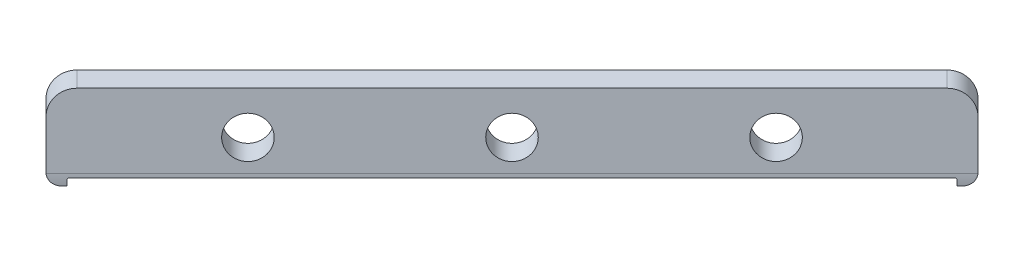
ISO-10303-21;
HEADER;
FILE_DESCRIPTION(('STEP AP214'),'2;1');
FILE_NAME('part.step','',(''),(''),'','','');
FILE_SCHEMA(('AUTOMOTIVE_DESIGN { 1 0 10303 214 1 1 1 1 }'));
ENDSEC;
DATA;
#1=APPLICATION_CONTEXT('core data for automotive mechanical design processes');
#2=APPLICATION_PROTOCOL_DEFINITION('international standard','automotive_design',2000,#1);
#3=PRODUCT_CONTEXT('',#1,'mechanical');
#4=PRODUCT('Part','Part','',(#3));
#5=PRODUCT_RELATED_PRODUCT_CATEGORY('part','',(#4));
#6=PRODUCT_DEFINITION_FORMATION('','',#4);
#7=PRODUCT_DEFINITION_CONTEXT('part definition',#1,'design');
#8=PRODUCT_DEFINITION('design','',#6,#7);
#9=PRODUCT_DEFINITION_SHAPE('','',#8);
#10=(LENGTH_UNIT() NAMED_UNIT(*) SI_UNIT(.MILLI.,.METRE.));
#11=(NAMED_UNIT(*) PLANE_ANGLE_UNIT() SI_UNIT($,.RADIAN.));
#12=(NAMED_UNIT(*) SI_UNIT($,.STERADIAN.) SOLID_ANGLE_UNIT());
#13=UNCERTAINTY_MEASURE_WITH_UNIT(LENGTH_MEASURE(1.E-05),#10,'distance_accuracy_value','');
#14=(GEOMETRIC_REPRESENTATION_CONTEXT(3) GLOBAL_UNCERTAINTY_ASSIGNED_CONTEXT((#13)) GLOBAL_UNIT_ASSIGNED_CONTEXT((#10,
#11,#12)) REPRESENTATION_CONTEXT('',''));
#15=CARTESIAN_POINT('',(0.,0.,0.));
#16=DIRECTION('',(0.,0.,1.));
#17=DIRECTION('',(1.,0.,0.));
#18=AXIS2_PLACEMENT_3D('',#15,#16,#17);
#19=CARTESIAN_POINT('',(-31.2479851302293,62.4688922805225,22.6335515961857));
#20=DIRECTION('',(-0.707106781186548,0.,0.707106781186547));
#21=DIRECTION('',(0.707106781186547,0.,0.707106781186548));
#22=AXIS2_PLACEMENT_3D('',#19,#20,#21);
#23=CYLINDRICAL_SURFACE('',#22,8.88999999999997);
#24=CARTESIAN_POINT('',(28.0159868484195,62.848,-24.0694986537815));
#25=CARTESIAN_POINT('',(28.0412127432073,62.8480002282446,-24.094726311048));
#26=CARTESIAN_POINT('',(28.0663830266467,62.8495042320577,-24.119985435108));
#27=CARTESIAN_POINT('',(28.1164494224557,62.8555042468426,-24.1704176401292));
#28=CARTESIAN_POINT('',(28.141345546684,62.8600001278811,-24.1955907247791));
#29=CARTESIAN_POINT('',(28.2153050213039,62.8779339085081,-24.2706830542423));
#30=CARTESIAN_POINT('',(28.2637187168926,62.8958180566461,-24.3202545375815));
#31=CARTESIAN_POINT('',(28.3571919829413,62.9429431235003,-24.4171103185936));
#32=CARTESIAN_POINT('',(28.4022498152059,62.9721898794838,-24.4643934266052));
#33=CARTESIAN_POINT('',(28.4874929717257,63.0411918179341,-24.5555514917085));
#34=CARTESIAN_POINT('',(28.5276794464005,63.0809445122393,-24.5994272525958));
#35=CARTESIAN_POINT('',(28.601704805909,63.1697413612886,-24.6827521998747));
#36=CARTESIAN_POINT('',(28.6355519643493,63.2187732350158,-24.7222071285899));
#37=CARTESIAN_POINT('',(28.6957126012145,63.3247343319157,-24.7959575845149));
#38=CARTESIAN_POINT('',(28.7220241511032,63.3816655711945,-24.8302517899126));
#39=CARTESIAN_POINT('',(28.7660461362825,63.501597398496,-24.8929457981475));
#40=CARTESIAN_POINT('',(28.7837723097044,63.5645866253135,-24.9213563313662));
#41=CARTESIAN_POINT('',(28.8099945653006,63.6948434084975,-24.9718427067502));
#42=CARTESIAN_POINT('',(28.8184989911839,63.7621070390009,-24.9939242619539));
#43=CARTESIAN_POINT('',(28.8240547282998,63.8634613155389,-25.0216931463825));
#44=CARTESIAN_POINT('',(28.8247554791441,63.8967054815829,-25.0299509305406));
#45=CARTESIAN_POINT('',(28.8239502498098,63.9634555626428,-25.0448754181973));
#46=CARTESIAN_POINT('',(28.822448520219,63.9969608496769,-25.0515451576238));
#47=CARTESIAN_POINT('',(28.8198509606969,64.0305353167753,-25.0574213196607));
#48=B_SPLINE_CURVE_WITH_KNOTS('',3,(#24,#25,#26,#27,#28,#29,#30,#31,#32,#33,#34,#35,#36,#37,#38,
#39,#40,#41,#42,#43,#44,#45,#46,#47),.UNSPECIFIED.,.F.,.F.,(4,2,2,2,2,2,2,2,2,2,2,4),(0.,
0.106962475027656,0.213920305124181,0.427504207309742,0.641197978500124,0.854841185061864,
1.06820358711933,1.28162054484922,1.49464478624726,1.70747612503121,1.81016795374532,
1.91266185714429),.UNSPECIFIED.);
#49=CARTESIAN_POINT('',(28.0159868484195,62.848,-24.0694986537815));
#50=VERTEX_POINT('',#49);
#51=CARTESIAN_POINT('',(28.8198509606969,64.0305353167753,-25.0574213196607));
#52=VERTEX_POINT('',#51);
#53=EDGE_CURVE('E299',#50,#52,#48,.T.);
#54=ORIENTED_EDGE('',*,*,#53,.T.);
#55=DIRECTION('',(-0.707106781186547,0.,0.707106781186547));
#56=VECTOR('',#55,1.);
#57=CARTESIAN_POINT('',(126.706774903379,64.0305353167753,-122.944345262343));
#58=LINE('',#57,#56);
#59=CARTESIAN_POINT('',(-25.0574213196608,64.0305353167753,28.819850960697));
#60=VERTEX_POINT('',#59);
#61=EDGE_CURVE('E434',#52,#60,#58,.T.);
#62=ORIENTED_EDGE('',*,*,#61,.T.);
#63=CARTESIAN_POINT('',(-25.0574213196608,64.0305353167753,28.819850960697));
#64=CARTESIAN_POINT('',(-25.0512550898484,63.995303137591,28.8225771900658));
#65=CARTESIAN_POINT('',(-25.0442146697091,63.9601465962603,28.8240959695621));
#66=CARTESIAN_POINT('',(-25.0284054763063,63.8902016106206,28.8247119564732));
#67=CARTESIAN_POINT('',(-25.0196366316676,63.8554131815751,28.823809063866));
#68=CARTESIAN_POINT('',(-24.9907939933517,63.7520215129004,28.8174633155482));
#69=CARTESIAN_POINT('',(-24.9681675664186,63.684296942904,28.8083906738733));
#70=CARTESIAN_POINT('',(-24.916496122564,63.5533070852542,28.7808866686694));
#71=CARTESIAN_POINT('',(-24.887445190294,63.4900459785954,28.7624466597295));
#72=CARTESIAN_POINT('',(-24.8234694406399,63.3699398805663,28.7169424505318));
#73=CARTESIAN_POINT('',(-24.788546905267,63.3130924108106,28.6898815971417));
#74=CARTESIAN_POINT('',(-24.7138285327782,63.2079609677876,28.6284529817684));
#75=CARTESIAN_POINT('',(-24.6740763185134,63.1596087617593,28.5941488241688));
#76=CARTESIAN_POINT('',(-24.5902683590469,63.0722836713819,28.5193544181621));
#77=CARTESIAN_POINT('',(-24.5462109496826,63.0333144343195,28.4788617741727));
#78=CARTESIAN_POINT('',(-24.4547848884541,62.9659116618471,28.3931371894814));
#79=CARTESIAN_POINT('',(-24.4074160958277,62.9374785746382,28.3479050472693));
#80=CARTESIAN_POINT('',(-24.3105054289195,62.8919874100948,28.2542258527261));
#81=CARTESIAN_POINT('',(-24.2609659826549,62.8749169524788,28.2057823628693));
#82=CARTESIAN_POINT('',(-24.1875085628317,62.8585081004216,28.1333554558058));
#83=CARTESIAN_POINT('',(-24.1639147231076,62.8545666439897,28.110003860227));
#84=CARTESIAN_POINT('',(-24.116704332366,62.8493152864763,28.0631133312156));
#85=CARTESIAN_POINT('',(-24.0930878963775,62.8480007174394,28.0395748048469));
#86=CARTESIAN_POINT('',(-24.0694986537816,62.848,28.0159868484195));
#87=B_SPLINE_CURVE_WITH_KNOTS('',3,(#63,#64,#65,#66,#67,#68,#69,#70,#71,#72,#73,#74,#75,#76,#77,
#78,#79,#80,#81,#82,#83,#84,#85,#86),.UNSPECIFIED.,.F.,.F.,(4,2,2,2,2,2,2,2,2,2,2,4),(0.,
0.107551107391848,0.215106657023032,0.429931453154058,0.644954878423281,0.859894926738172,
1.07302070294807,1.28622919076418,1.49944674729429,1.71243160828462,1.81263053817298,
1.91265125655463),.UNSPECIFIED.);
#88=CARTESIAN_POINT('',(-24.0694986537816,62.848,28.0159868484195));
#89=VERTEX_POINT('',#88);
#90=EDGE_CURVE('E266',#60,#89,#87,.T.);
#91=ORIENTED_EDGE('',*,*,#90,.T.);
#92=DIRECTION('',(-0.707106781186548,0.,0.707106781186547));
#93=VECTOR('',#92,1.);
#94=CARTESIAN_POINT('',(-24.9675242658885,62.848,28.9140124605265));
#95=LINE('',#94,#93);
#96=CARTESIAN_POINT('',(-23.7590219689426,62.848,27.7055101635805));
#97=VERTEX_POINT('',#96);
#98=EDGE_CURVE('E261',#97,#89,#95,.T.);
#99=ORIENTED_EDGE('',*,*,#98,.F.);
#100=CARTESIAN_POINT('',(-30.0394828332833,62.4688922805225,21.4250492992397));
#101=DIRECTION('',(-0.707106781186548,0.,0.707106781186547));
#102=DIRECTION('',(0.707106781186547,0.,0.707106781186548));
#103=AXIS2_PLACEMENT_3D('',#100,#101,#102);
#104=CIRCLE('',#103,8.88999999999997);
#105=CARTESIAN_POINT('',(-23.7893450362556,63.4195,27.6751870962675));
#106=VERTEX_POINT('',#105);
#107=EDGE_CURVE('E187',#106,#97,#104,.F.);
#108=ORIENTED_EDGE('',*,*,#107,.F.);
#109=CARTESIAN_POINT('',(-23.6706000891359,63.61,27.5245243597551));
#110=CARTESIAN_POINT('',(-23.6781364159323,63.6100093811594,27.5320581912541));
#111=CARTESIAN_POINT('',(-23.6855861216682,63.6091064455361,27.5396739374241));
#112=CARTESIAN_POINT('',(-23.7001047338185,63.6055459057236,27.5548431305062));
#113=CARTESIAN_POINT('',(-23.707174029225,63.6028901322639,27.5623966341019));
#114=CARTESIAN_POINT('',(-23.720743443548,63.5958922595912,27.5772347104279));
#115=CARTESIAN_POINT('',(-23.7272433407812,63.5915495071326,27.5845191777818));
#116=CARTESIAN_POINT('',(-23.7394947471439,63.5813086312477,27.5986057435977));
#117=CARTESIAN_POINT('',(-23.7452463311031,63.5754106635185,27.6054078902597));
#118=CARTESIAN_POINT('',(-23.7558711489443,63.5622021923687,27.6183617328608));
#119=CARTESIAN_POINT('',(-23.760740798807,63.5548861647993,27.6245107344846));
#120=CARTESIAN_POINT('',(-23.7694484743403,63.5390641309544,27.6359520537139));
#121=CARTESIAN_POINT('',(-23.7732862764535,63.5305578674113,27.6412441855734));
#122=CARTESIAN_POINT('',(-23.7798573716298,63.512527382874,27.6508560485324));
#123=CARTESIAN_POINT('',(-23.7825819316186,63.5029958273252,27.6551679776405));
#124=CARTESIAN_POINT('',(-23.7868144025665,63.4832392574551,27.662640982305));
#125=CARTESIAN_POINT('',(-23.7883229364736,63.4730146011108,27.6658026466651));
#126=CARTESIAN_POINT('',(-23.7898038628538,63.4555290697676,27.6700650784476));
#127=CARTESIAN_POINT('',(-23.7901146383983,63.4483749946559,27.6715016473021));
#128=CARTESIAN_POINT('',(-23.7901605482096,63.4339819164993,27.6737872572717));
#129=CARTESIAN_POINT('',(-23.7898964748386,63.4267430440187,27.6746371049865));
#130=CARTESIAN_POINT('',(-23.7893450362566,63.4195000000003,27.6751870962684));
#131=B_SPLINE_CURVE_WITH_KNOTS('',3,(#109,#110,#111,#112,#113,#114,#115,#116,#117,#118,#119,
#120,#121,#122,#123,#124,#125,#126,#127,#128,#129,#130),.UNSPECIFIED.,.F.,.F.,(4,2,2,2,2,2,2,2,
2,2,4),(0.,0.0319249195042498,0.0638165480767363,0.0957205383123213,0.127621335758462,
0.159648997530195,0.191683592752633,0.22396487669861,0.256229613003091,0.278096162980437,
0.299932591553004),.UNSPECIFIED.);
#132=CARTESIAN_POINT('',(-23.6706000891359,63.61,27.5245243597551));
#133=VERTEX_POINT('',#132);
#134=EDGE_CURVE('E185',#133,#106,#131,.T.);
#135=ORIENTED_EDGE('',*,*,#134,.F.);
#136=DIRECTION('',(-0.707106781186548,0.,0.707106781186547));
#137=VECTOR('',#136,1.);
#138=CARTESIAN_POINT('',(-25.0138062278978,63.61,28.8677304985171));
#139=LINE('',#138,#137);
#140=CARTESIAN_POINT('',(27.5245243597551,63.61,-23.6706000891358));
#141=VERTEX_POINT('',#140);
#142=EDGE_CURVE('E172',#133,#141,#139,.F.);
#143=ORIENTED_EDGE('',*,*,#142,.T.);
#144=CARTESIAN_POINT('',(27.6751870962675,63.4195,-23.7893450362555));
#145=CARTESIAN_POINT('',(27.6743742936584,63.4302771604047,-23.7901702881258));
#146=CARTESIAN_POINT('',(27.6728879495397,63.4410493246205,-23.7903515763147));
#147=CARTESIAN_POINT('',(27.6686428760586,63.4622782563258,-23.7894464589367));
#148=CARTESIAN_POINT('',(27.665884988579,63.4727352276302,-23.7883608914219));
#149=CARTESIAN_POINT('',(27.6591686222543,63.4930483527569,-23.7849425021465));
#150=CARTESIAN_POINT('',(27.6552095594449,63.5029042115366,-23.782609073303));
#151=CARTESIAN_POINT('',(27.6462100236924,63.5217275994173,-23.7767557464696));
#152=CARTESIAN_POINT('',(27.641169765034,63.5306953040297,-23.7732360835033));
#153=CARTESIAN_POINT('',(27.6301633725775,63.5474728462038,-23.7651068959936));
#154=CARTESIAN_POINT('',(27.6241987593929,63.5552845449214,-23.7604991549917));
#155=CARTESIAN_POINT('',(27.61151111056,63.5695416169412,-23.7503105710078));
#156=CARTESIAN_POINT('',(27.6047879414603,63.5759867492497,-23.7447295567053));
#157=CARTESIAN_POINT('',(27.5908258386263,63.5872834801227,-23.7327829971168));
#158=CARTESIAN_POINT('',(27.5835902636188,63.5921444640245,-23.7264223914855));
#159=CARTESIAN_POINT('',(27.5687811482089,63.6001791300746,-23.7130657989879));
#160=CARTESIAN_POINT('',(27.5612078477685,63.6033539901837,-23.7060702597106));
#161=CARTESIAN_POINT('',(27.5487426892403,63.6070882495557,-23.6942859726349));
#162=CARTESIAN_POINT('',(27.5438825918952,63.6081794806285,-23.6896252892082));
#163=CARTESIAN_POINT('',(27.5341793361975,63.6096352320611,-23.6801882959543));
#164=CARTESIAN_POINT('',(27.5293361636248,63.6100007745873,-23.6754121583681));
#165=CARTESIAN_POINT('',(27.5245243597553,63.6100000000006,-23.6706000891358));
#166=B_SPLINE_CURVE_WITH_KNOTS('',3,(#144,#145,#146,#147,#148,#149,#150,#151,#152,#153,#154,
#155,#156,#157,#158,#159,#160,#161,#162,#163,#164,#165),.UNSPECIFIED.,.F.,.F.,(4,2,2,2,2,2,2,2,
2,2,4),(0.,0.0324745968833057,0.0649277233003419,0.0973966525022864,0.129859152549427,
0.162268806055497,0.194684170249625,0.226903841408519,0.259100973531686,0.279528826582497,
0.299927885572257),.UNSPECIFIED.);
#167=CARTESIAN_POINT('',(27.6751870962675,63.4195,-23.7893450362555));
#168=VERTEX_POINT('',#167);
#169=EDGE_CURVE('E254',#168,#141,#166,.T.);
#170=ORIENTED_EDGE('',*,*,#169,.F.);
#171=CARTESIAN_POINT('',(21.4250492992397,62.4688922805225,-30.0394828332833));
#172=DIRECTION('',(0.707106781186547,0.,-0.707106781186548));
#173=DIRECTION('',(-0.707106781186548,0.,-0.707106781186547));
#174=AXIS2_PLACEMENT_3D('',#171,#172,#173);
#175=CIRCLE('',#174,8.88999999999997);
#176=CARTESIAN_POINT('',(27.7055101635805,62.848,-23.7590219689425));
#177=VERTEX_POINT('',#176);
#178=EDGE_CURVE('E263',#177,#168,#175,.F.);
#179=ORIENTED_EDGE('',*,*,#178,.F.);
#180=DIRECTION('',(-0.707106781186548,0.,0.707106781186547));
#181=VECTOR('',#180,1.);
#182=CARTESIAN_POINT('',(-24.9675242658885,62.848,28.9140124605265));
#183=LINE('',#182,#181);
#184=EDGE_CURVE('E275',#50,#177,#183,.T.);
#185=ORIENTED_EDGE('',*,*,#184,.F.);
#186=EDGE_LOOP('',(#54,#62,#91,#99,#108,#135,#143,#170,#179,#185));
#187=FACE_BOUND('',#186,.T.);
#188=ADVANCED_FACE('F49',(#187),#23,.T.);
#189=CARTESIAN_POINT('',(126.706774903379,64.0305353167753,-122.944345262343));
#190=DIRECTION('',(-0.696111539655782,-0.175662883717971,-0.696111539655782));
#191=DIRECTION('',(-0.707106781186548,0.,0.707106781186548));
#192=AXIS2_PLACEMENT_3D('',#189,#190,#191);
#193=PLANE('',#192);
#194=CARTESIAN_POINT('',(1.47840756711169,67.223000013,1.4784075671115));
#195=DIRECTION('',(-0.696111539655782,-0.175662883717971,-0.696111539655782));
#196=DIRECTION('',(-0.124212416279804,0.984450380305623,-0.124212416279719));
#197=AXIS2_PLACEMENT_3D('',#194,#195,#196);
#198=ELLIPSE('',#197,2.18395974343829,2.15);
#199=CARTESIAN_POINT('',(1.2071326503214,69.373000013,1.2071326503214));
#200=VERTEX_POINT('',#199);
#201=EDGE_CURVE('E330',#200,#200,#198,.F.);
#202=ORIENTED_EDGE('',*,*,#201,.F.);
#203=EDGE_LOOP('',(#202));
#204=FACE_BOUND('',#203,.T.);
#205=CARTESIAN_POINT('',(27.9129217694494,64.118,-24.1725637327517));
#206=DIRECTION('',(-0.696111539655782,-0.175662883717971,-0.696111539655782));
#207=DIRECTION('',(0.124212416279759,-0.984450380305623,0.124212416279764));
#208=AXIS2_PLACEMENT_3D('',#205,#206,#207);
#209=ELLIPSE('',#208,1.29005994147285,1.27);
#210=CARTESIAN_POINT('',(28.8109473815563,64.118,-25.0705893448586));
#211=VERTEX_POINT('',#210);
#212=EDGE_CURVE('E306',#52,#211,#209,.F.);
#213=ORIENTED_EDGE('',*,*,#212,.T.);
#214=DIRECTION('',(0.124212416279762,-0.984450380305623,0.124212416279762));
#215=VECTOR('',#214,1.);
#216=CARTESIAN_POINT('',(28.4457652343417,67.0122654403931,-25.4357714920732));
#217=LINE('',#216,#215);
#218=CARTESIAN_POINT('',(28.1876459415578,69.058000026,-25.693890784857));
#219=VERTEX_POINT('',#218);
#220=EDGE_CURVE('E321',#219,#211,#217,.T.);
#221=ORIENTED_EDGE('',*,*,#220,.F.);
#222=CARTESIAN_POINT('',(26.391594717344,69.058000026,-23.8978395606432));
#223=DIRECTION('',(-0.696111539655782,-0.175662883717971,-0.696111539655782));
#224=DIRECTION('',(-0.124212416279759,0.984450380305623,-0.124212416279764));
#225=AXIS2_PLACEMENT_3D('',#222,#223,#224);
#226=ELLIPSE('',#225,2.58011988294571,2.54);
#227=CARTESIAN_POINT('',(26.0711117923919,71.598000026,-24.2183224855954));
#228=VERTEX_POINT('',#227);
#229=EDGE_CURVE('E315',#219,#228,#226,.F.);
#230=ORIENTED_EDGE('',*,*,#229,.T.);
#231=DIRECTION('',(-0.707106781186548,0.,0.707106781186548));
#232=VECTOR('',#231,1.);
#233=CARTESIAN_POINT('',(0.926394653398243,71.598000026,0.926394653398243));
#234=LINE('',#233,#232);
#235=CARTESIAN_POINT('',(-24.2183224855954,71.598000026,26.0711117923919));
#236=VERTEX_POINT('',#235);
#237=EDGE_CURVE('E307',#228,#236,#234,.T.);
#238=ORIENTED_EDGE('',*,*,#237,.T.);
#239=CARTESIAN_POINT('',(-23.8978395606433,69.058000026,26.391594717344));
#240=DIRECTION('',(-0.696111539655782,-0.175662883717971,-0.696111539655782));
#241=DIRECTION('',(-0.124212416279761,0.984450380305623,-0.124212416279762));
#242=AXIS2_PLACEMENT_3D('',#239,#240,#241);
#243=ELLIPSE('',#242,2.58011988294571,2.54);
#244=CARTESIAN_POINT('',(-25.6938907848571,69.058000026,28.1876459415579));
#245=VERTEX_POINT('',#244);
#246=EDGE_CURVE('E426',#236,#245,#243,.F.);
#247=ORIENTED_EDGE('',*,*,#246,.T.);
#248=DIRECTION('',(-0.124212416279762,0.984450380305623,-0.124212416279762));
#249=VECTOR('',#248,1.);
#250=CARTESIAN_POINT('',(-25.4357714920732,67.0122654403931,28.4457652343418));
#251=LINE('',#250,#249);
#252=CARTESIAN_POINT('',(-25.0705893448586,64.118,28.8109473815563));
#253=VERTEX_POINT('',#252);
#254=EDGE_CURVE('E311',#253,#245,#251,.T.);
#255=ORIENTED_EDGE('',*,*,#254,.F.);
#256=CARTESIAN_POINT('',(-24.1725637327517,64.118,27.9129217694494));
#257=DIRECTION('',(-0.696111539655782,-0.175662883717971,-0.696111539655782));
#258=DIRECTION('',(0.124212416279761,-0.984450380305623,0.124212416279762));
#259=AXIS2_PLACEMENT_3D('',#256,#257,#258);
#260=ELLIPSE('',#259,1.29005994147285,1.27);
#261=EDGE_CURVE('E274',#253,#60,#260,.F.);
#262=ORIENTED_EDGE('',*,*,#261,.T.);
#263=ORIENTED_EDGE('',*,*,#61,.F.);
#264=EDGE_LOOP('',(#213,#221,#230,#238,#247,#255,#262,#263));
#265=FACE_BOUND('',#264,.T.);
#266=CARTESIAN_POINT('',(-13.7880278387059,67.223000013,16.7448429729291));
#267=DIRECTION('',(-0.696111539655782,-0.175662883717971,-0.696111539655782));
#268=DIRECTION('',(-0.124212416279804,0.984450380305623,-0.124212416279719));
#269=AXIS2_PLACEMENT_3D('',#266,#267,#268);
#270=ELLIPSE('',#269,2.18395974343829,2.15);
#271=CARTESIAN_POINT('',(-14.0593027554962,69.373000013,16.473568056139));
#272=VERTEX_POINT('',#271);
#273=EDGE_CURVE('E326',#272,#272,#270,.F.);
#274=ORIENTED_EDGE('',*,*,#273,.F.);
#275=EDGE_LOOP('',(#274));
#276=FACE_BOUND('',#275,.T.);
#277=CARTESIAN_POINT('',(16.7448429729293,67.223000013,-13.7880278387061));
#278=DIRECTION('',(-0.696111539655782,-0.175662883717971,-0.696111539655782));
#279=DIRECTION('',(-0.124212416279804,0.984450380305623,-0.124212416279719));
#280=AXIS2_PLACEMENT_3D('',#277,#278,#279);
#281=ELLIPSE('',#280,2.18395974343829,2.15);
#282=CARTESIAN_POINT('',(16.473568056139,69.373000013,-14.0593027554962));
#283=VERTEX_POINT('',#282);
#284=EDGE_CURVE('E53',#283,#283,#281,.F.);
#285=ORIENTED_EDGE('',*,*,#284,.F.);
#286=EDGE_LOOP('',(#285));
#287=FACE_BOUND('',#286,.T.);
#288=ADVANCED_FACE('F221',(#204,#265,#276,#287),#193,.F.);
#289=CARTESIAN_POINT('',(-31.2479851302293,62.4688922805225,22.6335515961857));
#290=DIRECTION('',(-0.707106781186548,0.,0.707106781186547));
#291=DIRECTION('',(0.707106781186547,0.,0.707106781186548));
#292=AXIS2_PLACEMENT_3D('',#289,#290,#291);
#293=CYLINDRICAL_SURFACE('',#292,6.34999999999997);
#294=CARTESIAN_POINT('',(-25.8678407481079,62.848,26.2176447540933));
#295=CARTESIAN_POINT('',(-25.8930326575949,62.8480002383866,26.2428341998516));
#296=CARTESIAN_POINT('',(-25.9182733473996,62.8494999436974,26.2679507582818));
#297=CARTESIAN_POINT('',(-25.9687066254805,62.8554827661656,26.317872931931));
#298=CARTESIAN_POINT('',(-25.9938992155361,62.8599657707176,26.3426785588501));
#299=CARTESIAN_POINT('',(-26.069110714877,62.8778479561075,26.4163073029911));
#300=CARTESIAN_POINT('',(-26.1188430631923,62.8956804206999,26.4644221064262));
#301=CARTESIAN_POINT('',(-26.2162335357284,62.9426628209707,26.5570878158099));
#302=CARTESIAN_POINT('',(-26.2638907200332,62.9718178269363,26.6016371143141));
#303=CARTESIAN_POINT('',(-26.3561034814072,63.0405993482787,26.6855881854187));
#304=CARTESIAN_POINT('',(-26.4006590287997,63.0802259638317,26.7249899087697));
#305=CARTESIAN_POINT('',(-26.4856871785837,63.1686608700612,26.7970357319768));
#306=CARTESIAN_POINT('',(-26.5261677891742,63.2174505897662,26.8296932241771));
#307=CARTESIAN_POINT('',(-26.6024109340328,63.3227643026712,26.8869888299151));
#308=CARTESIAN_POINT('',(-26.6381786035779,63.3792797386642,26.9116357155954));
#309=CARTESIAN_POINT('',(-26.6843418197286,63.4621653884538,26.9396857492428));
#310=CARTESIAN_POINT('',(-26.6969888064256,63.4860728106907,26.9469167074439));
#311=CARTESIAN_POINT('',(-26.7214151792851,63.5346529845675,26.9599199944478));
#312=CARTESIAN_POINT('',(-26.7331961749473,63.5593241887589,26.9656950802686));
#313=CARTESIAN_POINT('',(-26.7445498168314,63.5843515921316,26.9707328364162));
#314=B_SPLINE_CURVE_WITH_KNOTS('',3,(#294,#295,#296,#297,#298,#299,#300,#301,#302,#303,#304,
#305,#306,#307,#308,#309,#310,#311,#312,#313),.UNSPECIFIED.,.F.,.F.,(4,2,2,2,2,2,2,2,2,4),(0.,
0.106809446859322,0.213614862400691,0.426891571525335,0.640263897293669,0.853638264355755,
1.06658476069097,1.27929727466326,1.36323761045996,1.44701777184125),.UNSPECIFIED.);
#315=CARTESIAN_POINT('',(-25.8678407481079,62.848,26.2176447540933));
#316=VERTEX_POINT('',#315);
#317=CARTESIAN_POINT('',(-26.7445498168314,63.5843515921316,26.9707328364162));
#318=VERTEX_POINT('',#317);
#319=EDGE_CURVE('E229',#316,#318,#314,.T.);
#320=ORIENTED_EDGE('',*,*,#319,.T.);
#321=DIRECTION('',(0.707106781186548,0.,-0.707106781186547));
#322=VECTOR('',#321,1.);
#323=CARTESIAN_POINT('',(-124.712468573069,63.5843515921316,124.938651592654));
#324=LINE('',#323,#322);
#325=CARTESIAN_POINT('',(-25.5519770201795,63.5843515921316,25.7781600397643));
#326=VERTEX_POINT('',#325);
#327=EDGE_CURVE('E58',#318,#326,#324,.T.);
#328=ORIENTED_EDGE('',*,*,#327,.T.);
#329=CARTESIAN_POINT('',(-25.5999532994436,63.4195,25.8645788330794));
#330=CARTESIAN_POINT('',(-25.6011190271965,63.430340143401,25.8634249925374));
#331=CARTESIAN_POINT('',(-25.6016400026022,63.4411729730562,25.8615842736351));
#332=CARTESIAN_POINT('',(-25.6014013833345,63.4625111440655,25.8566165853199));
#333=CARTESIAN_POINT('',(-25.6006433910383,63.4730168784358,25.8534912290973));
#334=CARTESIAN_POINT('',(-25.597857527791,63.4934248141258,25.8460354721139));
#335=CARTESIAN_POINT('',(-25.5958286394455,63.5033265249289,25.8417041074481));
#336=CARTESIAN_POINT('',(-25.5905486874866,63.5222339964957,25.8319677865949));
#337=CARTESIAN_POINT('',(-25.5872977756976,63.531239868383,25.8265629638135));
#338=CARTESIAN_POINT('',(-25.5794248471284,63.5485822440341,25.8144943009539));
#339=CARTESIAN_POINT('',(-25.5747343321825,63.5568497835228,25.8077756768608));
#340=CARTESIAN_POINT('',(-25.5641922450713,63.57183969694,25.7935209658953));
#341=CARTESIAN_POINT('',(-25.5583374522888,63.5785576705682,25.7859826383818));
#342=CARTESIAN_POINT('',(-25.5519770201795,63.5843515921316,25.7781600397644));
#343=B_SPLINE_CURVE_WITH_KNOTS('',3,(#329,#330,#331,#332,#333,#334,#335,#336,#337,#338,#339,
#340,#341,#342),.UNSPECIFIED.,.F.,.F.,(4,2,2,2,2,2,4),(0.,0.0328470318916258,0.0656529413479993,
0.0984851466403467,0.13131327420135,0.166042466407805,0.20086909716315),.UNSPECIFIED.);
#344=CARTESIAN_POINT('',(-25.5999532994436,63.4195,25.8645788330794));
#345=VERTEX_POINT('',#344);
#346=EDGE_CURVE('E66',#345,#326,#343,.T.);
#347=ORIENTED_EDGE('',*,*,#346,.F.);
#348=CARTESIAN_POINT('',(-30.0394828332833,62.4688922805225,21.4250492992397));
#349=DIRECTION('',(-0.707106781186548,0.,0.707106781186547));
#350=DIRECTION('',(0.707106781186547,0.,0.707106781186548));
#351=AXIS2_PLACEMENT_3D('',#348,#349,#350);
#352=CIRCLE('',#351,6.34999999999997);
#353=CARTESIAN_POINT('',(-25.5573640632688,62.848,25.9071680692542));
#354=VERTEX_POINT('',#353);
#355=EDGE_CURVE('E265',#354,#345,#352,.T.);
#356=ORIENTED_EDGE('',*,*,#355,.F.);
#357=DIRECTION('',(-0.707106781186548,0.,0.707106781186547));
#358=VECTOR('',#357,1.);
#359=CARTESIAN_POINT('',(-26.7658663602148,62.848,27.1156703662002));
#360=LINE('',#359,#358);
#361=EDGE_CURVE('E349',#316,#354,#360,.F.);
#362=ORIENTED_EDGE('',*,*,#361,.F.);
#363=EDGE_LOOP('',(#320,#328,#347,#356,#362));
#364=FACE_BOUND('',#363,.T.);
#365=ADVANCED_FACE('F216',(#364),#293,.F.);
#366=CARTESIAN_POINT('',(26.9707328364162,63.5843515921316,-26.7445498168313));
#367=CARTESIAN_POINT('',(26.964342598223,63.5525946007026,-26.7301441379426));
#368=CARTESIAN_POINT('',(26.9567604303396,63.5214091139956,-26.7150473571422));
#369=CARTESIAN_POINT('',(26.939296863966,63.4603908771054,-26.6835124076873));
#370=CARTESIAN_POINT('',(26.9294155358265,63.4305580855653,-26.6670742800859));
#371=CARTESIAN_POINT('',(26.8964923343699,63.3435148984239,-26.6158750270826));
#372=CARTESIAN_POINT('',(26.8701453900028,63.2886329629063,-26.5791719576846));
#373=CARTESIAN_POINT('',(26.8097638465934,63.1869017077059,-26.5012379263312));
#374=CARTESIAN_POINT('',(26.7757252626825,63.1400565739228,-26.4600046230709));
#375=CARTESIAN_POINT('',(26.7013258883454,63.0558039632086,-26.3737427799782));
#376=CARTESIAN_POINT('',(26.6609643302515,63.0183976336774,-26.3287137796199));
#377=CARTESIAN_POINT('',(26.5754285092302,62.9541220766349,-26.2357459682868));
#378=CARTESIAN_POINT('',(26.5302509230346,62.9272601858785,-26.1878051579805));
#379=CARTESIAN_POINT('',(26.4366913456806,62.8849032392556,-26.0901102388639));
#380=CARTESIAN_POINT('',(26.3883127380828,62.8693963836807,-26.0403580689637));
#381=CARTESIAN_POINT('',(26.3190874535499,62.8558506452326,-25.9699531844519));
#382=CARTESIAN_POINT('',(26.2988934125562,62.8529052147302,-25.9495065085991));
#383=CARTESIAN_POINT('',(26.258364215815,62.8489824180477,-25.9086430367684));
#384=CARTESIAN_POINT('',(26.2380294089951,62.8480012523767,-25.8882262595882));
#385=CARTESIAN_POINT('',(26.2176447540932,62.848,-25.8678407481078));
#386=B_SPLINE_CURVE_WITH_KNOTS('',3,(#366,#367,#368,#369,#370,#371,#372,#373,#374,#375,#376,
#377,#378,#379,#380,#381,#382,#383,#384,#385),.UNSPECIFIED.,.F.,.F.,(4,2,2,2,2,2,2,2,2,4),(0.,
0.106292818240315,0.212582384519946,0.424742816203669,0.637013416560271,0.849309808538253,
1.06175365430121,1.27397642221977,1.36058772442902,1.44703133130506),.UNSPECIFIED.);
#387=CARTESIAN_POINT('',(26.9707328364162,63.5843515921316,-26.7445498168313));
#388=VERTEX_POINT('',#387);
#389=CARTESIAN_POINT('',(26.2176447540932,62.848,-25.8678407481078));
#390=VERTEX_POINT('',#389);
#391=EDGE_CURVE('E293',#388,#390,#386,.T.);
#392=ORIENTED_EDGE('',*,*,#391,.T.);
#393=DIRECTION('',(-0.707106781186548,0.,0.707106781186547));
#394=VECTOR('',#393,1.);
#395=CARTESIAN_POINT('',(-26.7658663602148,62.848,27.1156703662002));
#396=LINE('',#395,#394);
#397=CARTESIAN_POINT('',(25.9071680692542,62.848,-25.5573640632688));
#398=VERTEX_POINT('',#397);
#399=EDGE_CURVE('E313',#398,#390,#396,.F.);
#400=ORIENTED_EDGE('',*,*,#399,.F.);
#401=CARTESIAN_POINT('',(21.4250492992397,62.4688922805225,-30.0394828332833));
#402=DIRECTION('',(0.707106781186547,0.,-0.707106781186548));
#403=DIRECTION('',(-0.707106781186548,0.,-0.707106781186547));
#404=AXIS2_PLACEMENT_3D('',#401,#402,#403);
#405=CIRCLE('',#404,6.34999999999997);
#406=CARTESIAN_POINT('',(25.8645788330794,63.4195,-25.5999532994436));
#407=VERTEX_POINT('',#406);
#408=EDGE_CURVE('E243',#407,#398,#405,.T.);
#409=ORIENTED_EDGE('',*,*,#408,.F.);
#410=CARTESIAN_POINT('',(25.7781600397643,63.5843515921316,-25.5519770201795));
#411=CARTESIAN_POINT('',(25.7854398673875,63.5789570059463,-25.5578955297714));
#412=CARTESIAN_POINT('',(25.7924742921487,63.5727648353606,-25.5633775021717));
#413=CARTESIAN_POINT('',(25.8058473754217,63.5590161595347,-25.5733403711867));
#414=CARTESIAN_POINT('',(25.8121875933244,63.5514628173384,-25.5778235358933));
#415=CARTESIAN_POINT('',(25.8240047649106,63.5351927022338,-25.5856905565663));
#416=CARTESIAN_POINT('',(25.829481378283,63.526475473172,-25.5890739797246));
#417=CARTESIAN_POINT('',(25.8394159654709,63.5081265349639,-25.5946645431848));
#418=CARTESIAN_POINT('',(25.8438734395018,63.4984943804026,-25.5968711070605));
#419=CARTESIAN_POINT('',(25.8520306204528,63.4775733008712,-25.6002153073015));
#420=CARTESIAN_POINT('',(25.8556079711483,63.4662153612634,-25.6012221522455));
#421=CARTESIAN_POINT('',(25.861257458684,63.4430746158796,-25.6017277895128));
#422=CARTESIAN_POINT('',(25.8633265067773,63.4312909898412,-25.6012234980118));
#423=CARTESIAN_POINT('',(25.8645788330794,63.4195,-25.5999532994436));
#424=B_SPLINE_CURVE_WITH_KNOTS('',3,(#410,#411,#412,#413,#414,#415,#416,#417,#418,#419,#420,
#421,#422,#423),.UNSPECIFIED.,.F.,.F.,(4,2,2,2,2,2,4),(0.,0.0324193500284201,0.0647643143687621,
0.0971219928443035,0.129495505604076,0.165145593074683,0.200868482329345),.UNSPECIFIED.);
#425=CARTESIAN_POINT('',(25.7781600397643,63.5843515921316,-25.5519770201795));
#426=VERTEX_POINT('',#425);
#427=EDGE_CURVE('E73',#426,#407,#424,.T.);
#428=ORIENTED_EDGE('',*,*,#427,.F.);
#429=EDGE_CURVE('E12',#426,#388,#324,.T.);
#430=ORIENTED_EDGE('',*,*,#429,.T.);
#431=EDGE_LOOP('',(#392,#400,#409,#428,#430));
#432=FACE_BOUND('',#431,.T.);
#433=ADVANCED_FACE('F220',(#432),#293,.F.);
#434=CARTESIAN_POINT('',(-124.712468573069,63.5843515921316,124.938651592654));
#435=DIRECTION('',(0.696111539655782,0.175662883717971,0.696111539655782));
#436=DIRECTION('',(0.707106781186548,0.,-0.707106781186547));
#437=AXIS2_PLACEMENT_3D('',#434,#435,#436);
#438=PLANE('',#437);
#439=CARTESIAN_POINT('',(-0.346012698393469,67.223000013,-0.346012698393618));
#440=DIRECTION('',(0.696111539655782,0.175662883717971,0.696111539655782));
#441=DIRECTION('',(-0.124212416279805,0.984450380305623,-0.124212416279718));
#442=AXIS2_PLACEMENT_3D('',#439,#440,#441);
#443=ELLIPSE('',#442,2.18395974343829,2.15);
#444=CARTESIAN_POINT('',(-0.617287615183762,69.373000013,-0.617287615183722));
#445=VERTEX_POINT('',#444);
#446=EDGE_CURVE('E328',#445,#445,#443,.F.);
#447=ORIENTED_EDGE('',*,*,#446,.F.);
#448=EDGE_LOOP('',(#447));
#449=FACE_BOUND('',#448,.T.);
#450=CARTESIAN_POINT('',(26.0885015039443,64.118,-25.9969839982568));
#451=DIRECTION('',(0.696111539655782,0.175662883717971,0.696111539655782));
#452=DIRECTION('',(0.12421241627976,-0.984450380305623,0.124212416279764));
#453=AXIS2_PLACEMENT_3D('',#450,#451,#452);
#454=ELLIPSE('',#453,1.29005994147285,1.27);
#455=CARTESIAN_POINT('',(26.9865271160512,64.118,-26.8950096103637));
#456=VERTEX_POINT('',#455);
#457=EDGE_CURVE('E305',#456,#388,#454,.F.);
#458=ORIENTED_EDGE('',*,*,#457,.T.);
#459=ORIENTED_EDGE('',*,*,#429,.F.);
#460=CARTESIAN_POINT('',(25.731453781651,63.4195,-25.4636706672399));
#461=DIRECTION('',(0.696111539655782,0.175662883717971,0.696111539655782));
#462=DIRECTION('',(0.124212416279765,-0.984450380305623,0.124212416279759));
#463=AXIS2_PLACEMENT_3D('',#460,#461,#462);
#464=ELLIPSE('',#463,0.193508991220928,0.1905);
#465=CARTESIAN_POINT('',(25.7074175622796,63.61,-25.4877068866113));
#466=VERTEX_POINT('',#465);
#467=EDGE_CURVE('E242',#466,#426,#464,.F.);
#468=ORIENTED_EDGE('',*,*,#467,.F.);
#469=DIRECTION('',(-0.707106781186548,0.,0.707106781186547));
#470=VECTOR('',#469,1.);
#471=CARTESIAN_POINT('',(0.109855337834174,63.61,0.109855337834174));
#472=LINE('',#471,#470);
#473=CARTESIAN_POINT('',(-25.4877068866113,63.61,25.7074175622797));
#474=VERTEX_POINT('',#473);
#475=EDGE_CURVE('E181',#466,#474,#472,.T.);
#476=ORIENTED_EDGE('',*,*,#475,.T.);
#477=CARTESIAN_POINT('',(-25.4636706672399,63.4195,25.7314537816511));
#478=DIRECTION('',(0.696111539655782,0.175662883717971,0.696111539655782));
#479=DIRECTION('',(-0.124212416279757,0.984450380305623,-0.124212416279766));
#480=AXIS2_PLACEMENT_3D('',#477,#478,#479);
#481=ELLIPSE('',#480,0.193508991220928,0.1905);
#482=EDGE_CURVE('E189',#326,#474,#481,.F.);
#483=ORIENTED_EDGE('',*,*,#482,.F.);
#484=ORIENTED_EDGE('',*,*,#327,.F.);
#485=CARTESIAN_POINT('',(-25.9969839982568,64.118,26.0885015039443));
#486=DIRECTION('',(0.696111539655782,0.175662883717971,0.696111539655782));
#487=DIRECTION('',(0.124212416279762,-0.984450380305623,0.124212416279762));
#488=AXIS2_PLACEMENT_3D('',#485,#486,#487);
#489=ELLIPSE('',#488,1.29005994147285,1.27);
#490=CARTESIAN_POINT('',(-26.8950096103637,64.118,26.9865271160512));
#491=VERTEX_POINT('',#490);
#492=EDGE_CURVE('E273',#318,#491,#489,.F.);
#493=ORIENTED_EDGE('',*,*,#492,.T.);
#494=DIRECTION('',(0.124212416279762,-0.984450380305623,0.124212416279762));
#495=VECTOR('',#494,1.);
#496=CARTESIAN_POINT('',(-27.2038948027989,66.5660817157495,26.6776419236161));
#497=LINE('',#496,#495);
#498=CARTESIAN_POINT('',(-27.5183110503622,69.058000026,26.3632256760527));
#499=VERTEX_POINT('',#498);
#500=EDGE_CURVE('E314',#499,#491,#497,.T.);
#501=ORIENTED_EDGE('',*,*,#500,.F.);
#502=CARTESIAN_POINT('',(-25.7222598261484,69.058000026,24.5671744518389));
#503=DIRECTION('',(0.696111539655782,0.175662883717971,0.696111539655782));
#504=DIRECTION('',(-0.124212416279762,0.984450380305623,-0.124212416279762));
#505=AXIS2_PLACEMENT_3D('',#502,#503,#504);
#506=ELLIPSE('',#505,2.5801198829457,2.54);
#507=CARTESIAN_POINT('',(-26.0427427511006,71.598000026,24.2466915268867));
#508=VERTEX_POINT('',#507);
#509=EDGE_CURVE('E182',#499,#508,#506,.F.);
#510=ORIENTED_EDGE('',*,*,#509,.T.);
#511=DIRECTION('',(0.707106781186548,0.,-0.707106781186547));
#512=VECTOR('',#511,1.);
#513=CARTESIAN_POINT('',(-0.898025612106901,71.598000026,-0.898025612106901));
#514=LINE('',#513,#512);
#515=CARTESIAN_POINT('',(24.2466915268867,71.598000026,-26.0427427511005));
#516=VERTEX_POINT('',#515);
#517=EDGE_CURVE('E310',#508,#516,#514,.T.);
#518=ORIENTED_EDGE('',*,*,#517,.T.);
#519=CARTESIAN_POINT('',(24.5671744518389,69.058000026,-25.7222598261484));
#520=DIRECTION('',(0.696111539655782,0.175662883717971,0.696111539655782));
#521=DIRECTION('',(-0.12421241627976,0.984450380305623,-0.124212416279764));
#522=AXIS2_PLACEMENT_3D('',#519,#520,#521);
#523=ELLIPSE('',#522,2.5801198829457,2.54);
#524=CARTESIAN_POINT('',(26.3632256760527,69.058000026,-27.5183110503622));
#525=VERTEX_POINT('',#524);
#526=EDGE_CURVE('E318',#516,#525,#523,.F.);
#527=ORIENTED_EDGE('',*,*,#526,.T.);
#528=DIRECTION('',(-0.124212416279762,0.984450380305623,-0.124212416279762));
#529=VECTOR('',#528,1.);
#530=CARTESIAN_POINT('',(26.677641923616,66.5660817157495,-27.2038948027988));
#531=LINE('',#530,#529);
#532=EDGE_CURVE('E323',#456,#525,#531,.T.);
#533=ORIENTED_EDGE('',*,*,#532,.F.);
#534=EDGE_LOOP('',(#458,#459,#468,#476,#483,#484,#493,#501,#510,#518,#527,#533));
#535=FACE_BOUND('',#534,.T.);
#536=CARTESIAN_POINT('',(-15.612448104211,67.223000013,14.9204227074239));
#537=DIRECTION('',(0.696111539655782,0.175662883717971,0.696111539655782));
#538=DIRECTION('',(-0.124212416279805,0.984450380305623,-0.124212416279718));
#539=AXIS2_PLACEMENT_3D('',#536,#537,#538);
#540=ELLIPSE('',#539,2.18395974343829,2.15);
#541=CARTESIAN_POINT('',(-15.8837230210013,69.373000013,14.6491477906338));
#542=VERTEX_POINT('',#541);
#543=EDGE_CURVE('E329',#542,#542,#540,.F.);
#544=ORIENTED_EDGE('',*,*,#543,.F.);
#545=EDGE_LOOP('',(#544));
#546=FACE_BOUND('',#545,.T.);
#547=CARTESIAN_POINT('',(14.9204227074241,67.223000013,-15.6124481042112));
#548=DIRECTION('',(0.696111539655782,0.175662883717971,0.696111539655782));
#549=DIRECTION('',(-0.124212416279805,0.984450380305623,-0.124212416279718));
#550=AXIS2_PLACEMENT_3D('',#547,#548,#549);
#551=ELLIPSE('',#550,2.18395974343829,2.15);
#552=CARTESIAN_POINT('',(14.6491477906338,69.373000013,-15.8837230210013));
#553=VERTEX_POINT('',#552);
#554=EDGE_CURVE('E332',#553,#553,#551,.F.);
#555=ORIENTED_EDGE('',*,*,#554,.F.);
#556=EDGE_LOOP('',(#555));
#557=FACE_BOUND('',#556,.T.);
#558=ADVANCED_FACE('F51',(#449,#535,#546,#557),#438,.F.);
#559=CARTESIAN_POINT('',(-41.937796085393,62.848,11.943740641022));
#560=DIRECTION('',(0.707106781186548,0.,-0.707106781186547));
#561=DIRECTION('',(-0.707106781186547,0.,-0.707106781186548));
#562=AXIS2_PLACEMENT_3D('',#559,#560,#561);
#563=PLANE('',#562);
#564=DIRECTION('',(0.707106781186547,0.,0.707106781186548));
#565=VECTOR('',#564,1.);
#566=CARTESIAN_POINT('',(-41.937796085393,64.118,11.943740641022));
#567=LINE('',#566,#565);
#568=EDGE_CURVE('E416',#491,#253,#567,.T.);
#569=ORIENTED_EDGE('',*,*,#568,.T.);
#570=ORIENTED_EDGE('',*,*,#254,.T.);
#571=DIRECTION('',(0.707106781186547,0.,0.707106781186548));
#572=VECTOR('',#571,1.);
#573=CARTESIAN_POINT('',(-37.4476680248584,69.058000026,16.4338687015565));
#574=LINE('',#573,#572);
#575=EDGE_CURVE('E411',#245,#499,#574,.F.);
#576=ORIENTED_EDGE('',*,*,#575,.T.);
#577=ORIENTED_EDGE('',*,*,#500,.T.);
#578=EDGE_LOOP('',(#569,#570,#576,#577));
#579=FACE_BOUND('',#578,.T.);
#580=ADVANCED_FACE('F284',(#579),#563,.F.);
#581=CARTESIAN_POINT('',(0.,71.598000026,0.));
#582=DIRECTION('',(0.,1.,0.));
#583=DIRECTION('',(0.,0.,1.));
#584=AXIS2_PLACEMENT_3D('',#581,#582,#583);
#585=PLANE('',#584);
#586=ORIENTED_EDGE('',*,*,#237,.F.);
#587=DIRECTION('',(0.707106781186547,0.,0.707106781186548));
#588=VECTOR('',#587,1.);
#589=CARTESIAN_POINT('',(14.6378174773427,71.598000026,-35.6516168006445));
#590=LINE('',#589,#588);
#591=EDGE_CURVE('E194',#228,#516,#590,.F.);
#592=ORIENTED_EDGE('',*,*,#591,.T.);
#593=ORIENTED_EDGE('',*,*,#517,.F.);
#594=DIRECTION('',(0.707106781186547,0.,0.707106781186548));
#595=VECTOR('',#594,1.);
#596=CARTESIAN_POINT('',(-14.6378174773427,71.598000026,35.6516168006446));
#597=LINE('',#596,#595);
#598=EDGE_CURVE('E199',#508,#236,#597,.T.);
#599=ORIENTED_EDGE('',*,*,#598,.T.);
#600=EDGE_LOOP('',(#586,#592,#593,#599));
#601=FACE_BOUND('',#600,.T.);
#602=ADVANCED_FACE('F389',(#601),#585,.T.);
#603=CARTESIAN_POINT('',(-25.1447171389937,69.058000026,25.1447171389936));
#604=DIRECTION('',(-0.707106781186547,0.,-0.707106781186548));
#605=DIRECTION('',(-0.707106781186548,0.,0.707106781186547));
#606=AXIS2_PLACEMENT_3D('',#603,#604,#605);
#607=CYLINDRICAL_SURFACE('',#606,2.54);
#608=ORIENTED_EDGE('',*,*,#246,.F.);
#609=ORIENTED_EDGE('',*,*,#598,.F.);
#610=ORIENTED_EDGE('',*,*,#509,.F.);
#611=ORIENTED_EDGE('',*,*,#575,.F.);
#612=EDGE_LOOP('',(#608,#609,#610,#611));
#613=FACE_BOUND('',#612,.T.);
#614=ADVANCED_FACE('F392',(#613),#607,.T.);
#615=CARTESIAN_POINT('',(11.943740641022,62.848,-41.9377960853929));
#616=DIRECTION('',(-0.707106781186548,0.,0.707106781186547));
#617=DIRECTION('',(0.707106781186547,0.,0.707106781186548));
#618=AXIS2_PLACEMENT_3D('',#615,#616,#617);
#619=PLANE('',#618);
#620=DIRECTION('',(0.707106781186547,0.,0.707106781186548));
#621=VECTOR('',#620,1.);
#622=CARTESIAN_POINT('',(37.4476680248584,69.058000026,-16.4338687015565));
#623=LINE('',#622,#621);
#624=EDGE_CURVE('E408',#525,#219,#623,.T.);
#625=ORIENTED_EDGE('',*,*,#624,.T.);
#626=ORIENTED_EDGE('',*,*,#220,.T.);
#627=DIRECTION('',(0.707106781186547,0.,0.707106781186548));
#628=VECTOR('',#627,1.);
#629=CARTESIAN_POINT('',(11.943740641022,64.118,-41.9377960853929));
#630=LINE('',#629,#628);
#631=EDGE_CURVE('E412',#211,#456,#630,.F.);
#632=ORIENTED_EDGE('',*,*,#631,.T.);
#633=ORIENTED_EDGE('',*,*,#532,.T.);
#634=EDGE_LOOP('',(#625,#626,#632,#633));
#635=FACE_BOUND('',#634,.T.);
#636=ADVANCED_FACE('F397',(#635),#619,.F.);
#637=CARTESIAN_POINT('',(10.1476894168081,69.058000026,-40.1417448611791));
#638=DIRECTION('',(-0.707106781186547,0.,-0.707106781186548));
#639=DIRECTION('',(-0.707106781186548,0.,0.707106781186547));
#640=AXIS2_PLACEMENT_3D('',#637,#638,#639);
#641=CYLINDRICAL_SURFACE('',#640,2.54);
#642=ORIENTED_EDGE('',*,*,#229,.F.);
#643=ORIENTED_EDGE('',*,*,#624,.F.);
#644=ORIENTED_EDGE('',*,*,#526,.F.);
#645=ORIENTED_EDGE('',*,*,#591,.F.);
#646=EDGE_LOOP('',(#642,#643,#644,#645));
#647=FACE_BOUND('',#646,.T.);
#648=ADVANCED_FACE('F291',(#647),#641,.T.);
#649=CARTESIAN_POINT('',(0.,62.848,0.));
#650=DIRECTION('',(0.,1.,0.));
#651=DIRECTION('',(0.,0.,1.));
#652=AXIS2_PLACEMENT_3D('',#649,#650,#651);
#653=PLANE('',#652);
#654=DIRECTION('',(-0.707106781186547,0.,-0.707106781186548));
#655=VECTOR('',#654,1.);
#656=CARTESIAN_POINT('',(-18.4556401033963,62.848,33.0088920291268));
#657=LINE('',#656,#655);
#658=EDGE_CURVE('E458',#97,#354,#657,.T.);
#659=ORIENTED_EDGE('',*,*,#658,.F.);
#660=ORIENTED_EDGE('',*,*,#98,.T.);
#661=DIRECTION('',(0.707106781186547,0.,0.707106781186548));
#662=VECTOR('',#661,1.);
#663=CARTESIAN_POINT('',(-26.0427427511006,62.848,26.0427427511006));
#664=LINE('',#663,#662);
#665=EDGE_CURVE('E453',#89,#316,#664,.F.);
#666=ORIENTED_EDGE('',*,*,#665,.T.);
#667=ORIENTED_EDGE('',*,*,#361,.T.);
#668=EDGE_LOOP('',(#659,#660,#666,#667));
#669=FACE_BOUND('',#668,.T.);
#670=ADVANCED_FACE('F394',(#669),#653,.F.);
#671=DIRECTION('',(0.707106781186547,0.,0.707106781186548));
#672=VECTOR('',#671,1.);
#673=CARTESIAN_POINT('',(26.0427427511005,62.848,-26.0427427511005));
#674=LINE('',#673,#672);
#675=EDGE_CURVE('E451',#390,#50,#674,.T.);
#676=ORIENTED_EDGE('',*,*,#675,.T.);
#677=ORIENTED_EDGE('',*,*,#184,.T.);
#678=DIRECTION('',(0.707106781186548,0.,0.707106781186547));
#679=VECTOR('',#678,1.);
#680=CARTESIAN_POINT('',(33.0088920291267,62.848,-18.4556401033963));
#681=LINE('',#680,#679);
#682=EDGE_CURVE('E454',#398,#177,#681,.T.);
#683=ORIENTED_EDGE('',*,*,#682,.F.);
#684=ORIENTED_EDGE('',*,*,#399,.T.);
#685=EDGE_LOOP('',(#676,#677,#683,#684));
#686=FACE_BOUND('',#685,.T.);
#687=ADVANCED_FACE('F396',(#686),#653,.F.);
#688=CARTESIAN_POINT('',(-18.4556401033963,63.61,33.0088920291268));
#689=DIRECTION('',(-0.707106781186548,0.,0.707106781186547));
#690=DIRECTION('',(0.707106781186547,0.,0.707106781186548));
#691=AXIS2_PLACEMENT_3D('',#688,#689,#690);
#692=PLANE('',#691);
#693=DIRECTION('',(-0.707106781186547,0.,-0.707106781186548));
#694=VECTOR('',#693,1.);
#695=CARTESIAN_POINT('',(-18.4556401033963,63.4195,33.0088920291268));
#696=LINE('',#695,#694);
#697=EDGE_CURVE('E205',#345,#106,#696,.F.);
#698=ORIENTED_EDGE('',*,*,#697,.T.);
#699=ORIENTED_EDGE('',*,*,#107,.T.);
#700=ORIENTED_EDGE('',*,*,#658,.T.);
#701=ORIENTED_EDGE('',*,*,#355,.T.);
#702=EDGE_LOOP('',(#698,#699,#700,#701));
#703=FACE_BOUND('',#702,.T.);
#704=ADVANCED_FACE('F468',(#703),#692,.F.);
#705=CARTESIAN_POINT('',(0.,63.61,0.));
#706=DIRECTION('',(0.,-1.,0.));
#707=DIRECTION('',(0.,0.,-1.));
#708=AXIS2_PLACEMENT_3D('',#705,#706,#707);
#709=PLANE('',#708);
#710=ORIENTED_EDGE('',*,*,#142,.F.);
#711=DIRECTION('',(-0.707106781186547,0.,-0.707106781186548));
#712=VECTOR('',#711,1.);
#713=CARTESIAN_POINT('',(-25.5975622244455,63.61,25.5975622244455));
#714=LINE('',#713,#712);
#715=EDGE_CURVE('E176',#133,#474,#714,.T.);
#716=ORIENTED_EDGE('',*,*,#715,.T.);
#717=ORIENTED_EDGE('',*,*,#475,.F.);
#718=DIRECTION('',(0.707106781186548,0.,0.707106781186547));
#719=VECTOR('',#718,1.);
#720=CARTESIAN_POINT('',(25.5975622244455,63.61,-25.5975622244455));
#721=LINE('',#720,#719);
#722=EDGE_CURVE('E178',#466,#141,#721,.T.);
#723=ORIENTED_EDGE('',*,*,#722,.T.);
#724=EDGE_LOOP('',(#710,#716,#717,#723));
#725=FACE_BOUND('',#724,.T.);
#726=ADVANCED_FACE('F174',(#725),#709,.T.);
#727=CARTESIAN_POINT('',(-25.5975622244455,63.4195,25.5975622244455));
#728=DIRECTION('',(-0.707106781186547,0.,-0.707106781186548));
#729=DIRECTION('',(-0.707106781186548,0.,0.707106781186547));
#730=AXIS2_PLACEMENT_3D('',#727,#728,#729);
#731=CYLINDRICAL_SURFACE('',#730,0.1905);
#732=ORIENTED_EDGE('',*,*,#715,.F.);
#733=ORIENTED_EDGE('',*,*,#134,.T.);
#734=ORIENTED_EDGE('',*,*,#697,.F.);
#735=ORIENTED_EDGE('',*,*,#346,.T.);
#736=ORIENTED_EDGE('',*,*,#482,.T.);
#737=EDGE_LOOP('',(#732,#733,#734,#735,#736));
#738=FACE_BOUND('',#737,.T.);
#739=ADVANCED_FACE('F191',(#738),#731,.F.);
#740=CARTESIAN_POINT('',(33.0088920291267,63.61,-18.4556401033963));
#741=DIRECTION('',(0.707106781186547,0.,-0.707106781186548));
#742=DIRECTION('',(-0.707106781186548,0.,-0.707106781186547));
#743=AXIS2_PLACEMENT_3D('',#740,#741,#742);
#744=PLANE('',#743);
#745=ORIENTED_EDGE('',*,*,#682,.T.);
#746=ORIENTED_EDGE('',*,*,#178,.T.);
#747=DIRECTION('',(0.707106781186548,0.,0.707106781186547));
#748=VECTOR('',#747,1.);
#749=CARTESIAN_POINT('',(33.0088920291267,63.4195,-18.4556401033963));
#750=LINE('',#749,#748);
#751=EDGE_CURVE('E196',#168,#407,#750,.F.);
#752=ORIENTED_EDGE('',*,*,#751,.T.);
#753=ORIENTED_EDGE('',*,*,#408,.T.);
#754=EDGE_LOOP('',(#745,#746,#752,#753));
#755=FACE_BOUND('',#754,.T.);
#756=ADVANCED_FACE('F249',(#755),#744,.F.);
#757=CARTESIAN_POINT('',(25.5975622244455,63.4195,-25.5975622244455));
#758=DIRECTION('',(0.707106781186548,0.,0.707106781186547));
#759=DIRECTION('',(0.707106781186547,0.,-0.707106781186548));
#760=AXIS2_PLACEMENT_3D('',#757,#758,#759);
#761=CYLINDRICAL_SURFACE('',#760,0.1905);
#762=ORIENTED_EDGE('',*,*,#751,.F.);
#763=ORIENTED_EDGE('',*,*,#169,.T.);
#764=ORIENTED_EDGE('',*,*,#722,.F.);
#765=ORIENTED_EDGE('',*,*,#467,.T.);
#766=ORIENTED_EDGE('',*,*,#427,.T.);
#767=EDGE_LOOP('',(#762,#763,#764,#765,#766));
#768=FACE_BOUND('',#767,.T.);
#769=ADVANCED_FACE('F245',(#768),#761,.F.);
#770=CARTESIAN_POINT('',(26.0427427511005,64.118,-26.0427427511005));
#771=DIRECTION('',(0.707106781186547,0.,0.707106781186548));
#772=DIRECTION('',(0.707106781186548,0.,-0.707106781186547));
#773=AXIS2_PLACEMENT_3D('',#770,#771,#772);
#774=CYLINDRICAL_SURFACE('',#773,1.27);
#775=ORIENTED_EDGE('',*,*,#212,.F.);
#776=ORIENTED_EDGE('',*,*,#53,.F.);
#777=ORIENTED_EDGE('',*,*,#675,.F.);
#778=ORIENTED_EDGE('',*,*,#391,.F.);
#779=ORIENTED_EDGE('',*,*,#457,.F.);
#780=ORIENTED_EDGE('',*,*,#631,.F.);
#781=EDGE_LOOP('',(#775,#776,#777,#778,#779,#780));
#782=FACE_BOUND('',#781,.T.);
#783=ADVANCED_FACE('F248',(#782),#774,.T.);
#784=CARTESIAN_POINT('',(-41.0397704732861,64.118,11.0457150289151));
#785=DIRECTION('',(0.707106781186547,0.,0.707106781186548));
#786=DIRECTION('',(0.707106781186548,0.,-0.707106781186547));
#787=AXIS2_PLACEMENT_3D('',#784,#785,#786);
#788=CYLINDRICAL_SURFACE('',#787,1.27);
#789=ORIENTED_EDGE('',*,*,#261,.F.);
#790=ORIENTED_EDGE('',*,*,#568,.F.);
#791=ORIENTED_EDGE('',*,*,#492,.F.);
#792=ORIENTED_EDGE('',*,*,#319,.F.);
#793=ORIENTED_EDGE('',*,*,#665,.F.);
#794=ORIENTED_EDGE('',*,*,#90,.F.);
#795=EDGE_LOOP('',(#789,#790,#791,#792,#793,#794));
#796=FACE_BOUND('',#795,.T.);
#797=ADVANCED_FACE('F277',(#796),#788,.T.);
#798=CARTESIAN_POINT('',(-22.8996531087262,67.223000013,7.63321770290899));
#799=DIRECTION('',(-0.707106781186555,0.,-0.70710678118654));
#800=DIRECTION('',(-0.70710678118654,0.,0.707106781186555));
#801=AXIS2_PLACEMENT_3D('',#798,#799,#800);
#802=CYLINDRICAL_SURFACE('',#801,2.15);
#803=ORIENTED_EDGE('',*,*,#273,.T.);
#804=EDGE_LOOP('',(#803));
#805=FACE_BOUND('',#804,.T.);
#806=ORIENTED_EDGE('',*,*,#543,.T.);
#807=EDGE_LOOP('',(#806));
#808=FACE_BOUND('',#807,.T.);
#809=ADVANCED_FACE('F282',(#805,#808),#802,.F.);
#810=CARTESIAN_POINT('',(-7.63321770290875,67.223000013,-7.63321770290874));
#811=DIRECTION('',(-0.707106781186555,0.,-0.70710678118654));
#812=DIRECTION('',(-0.70710678118654,0.,0.707106781186555));
#813=AXIS2_PLACEMENT_3D('',#810,#811,#812);
#814=CYLINDRICAL_SURFACE('',#813,2.15);
#815=ORIENTED_EDGE('',*,*,#201,.T.);
#816=EDGE_LOOP('',(#815));
#817=FACE_BOUND('',#816,.T.);
#818=ORIENTED_EDGE('',*,*,#446,.T.);
#819=EDGE_LOOP('',(#818));
#820=FACE_BOUND('',#819,.T.);
#821=ADVANCED_FACE('F374',(#817,#820),#814,.F.);
#822=CARTESIAN_POINT('',(7.63321770290868,67.223000013,-22.8996531087265));
#823=DIRECTION('',(-0.707106781186555,0.,-0.70710678118654));
#824=DIRECTION('',(-0.70710678118654,0.,0.707106781186555));
#825=AXIS2_PLACEMENT_3D('',#822,#823,#824);
#826=CYLINDRICAL_SURFACE('',#825,2.15);
#827=ORIENTED_EDGE('',*,*,#284,.T.);
#828=EDGE_LOOP('',(#827));
#829=FACE_BOUND('',#828,.T.);
#830=ORIENTED_EDGE('',*,*,#554,.T.);
#831=EDGE_LOOP('',(#830));
#832=FACE_BOUND('',#831,.T.);
#833=ADVANCED_FACE('F356',(#829,#832),#826,.F.);
#834=CLOSED_SHELL('',(#188,#288,#365,#433,#558,#580,#602,#614,#636,#648,#670,#687,#704,#726,
#739,#756,#769,#783,#797,#809,#821,#833));
#835=MANIFOLD_SOLID_BREP('B2',#834);
#836=ADVANCED_BREP_SHAPE_REPRESENTATION('',(#18,#835),#14);
#837=SHAPE_DEFINITION_REPRESENTATION(#9,#836);
ENDSEC;
END-ISO-10303-21;
